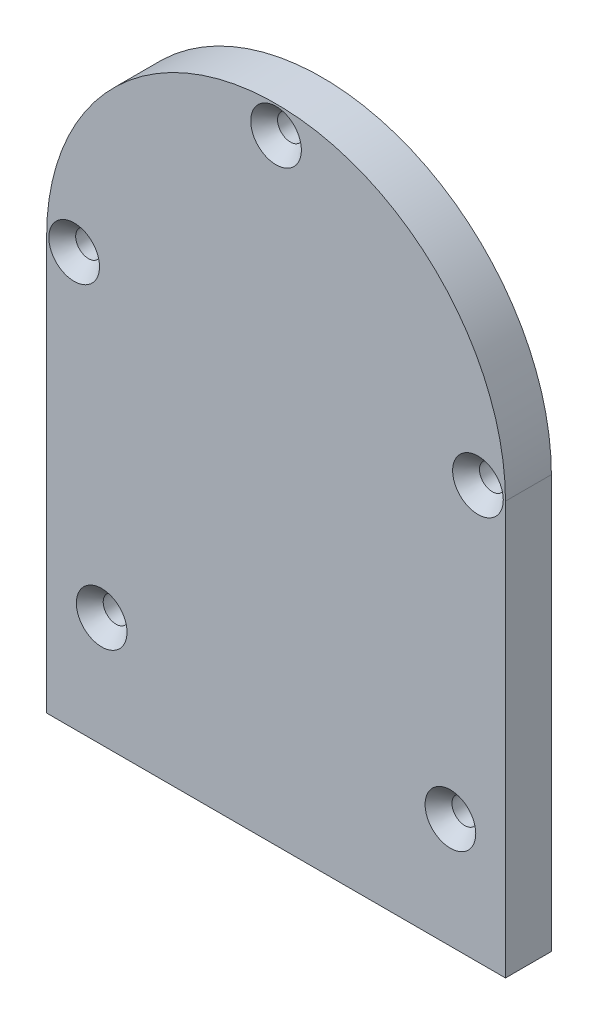
ISO-10303-21;
HEADER;
FILE_DESCRIPTION(('STEP AP214'),'2;1');
FILE_NAME('part.step','',(''),(''),'','','');
FILE_SCHEMA(('AUTOMOTIVE_DESIGN { 1 0 10303 214 1 1 1 1 }'));
ENDSEC;
DATA;
#1=APPLICATION_CONTEXT('core data for automotive mechanical design processes');
#2=APPLICATION_PROTOCOL_DEFINITION('international standard','automotive_design',2000,#1);
#3=PRODUCT_CONTEXT('',#1,'mechanical');
#4=PRODUCT('Part','Part','',(#3));
#5=PRODUCT_RELATED_PRODUCT_CATEGORY('part','',(#4));
#6=PRODUCT_DEFINITION_FORMATION('','',#4);
#7=PRODUCT_DEFINITION_CONTEXT('part definition',#1,'design');
#8=PRODUCT_DEFINITION('design','',#6,#7);
#9=PRODUCT_DEFINITION_SHAPE('','',#8);
#10=(LENGTH_UNIT() NAMED_UNIT(*) SI_UNIT(.MILLI.,.METRE.));
#11=(NAMED_UNIT(*) PLANE_ANGLE_UNIT() SI_UNIT($,.RADIAN.));
#12=(NAMED_UNIT(*) SI_UNIT($,.STERADIAN.) SOLID_ANGLE_UNIT());
#13=UNCERTAINTY_MEASURE_WITH_UNIT(LENGTH_MEASURE(1.E-05),#10,'distance_accuracy_value','');
#14=(GEOMETRIC_REPRESENTATION_CONTEXT(3) GLOBAL_UNCERTAINTY_ASSIGNED_CONTEXT((#13)) GLOBAL_UNIT_ASSIGNED_CONTEXT((#10,
#11,#12)) REPRESENTATION_CONTEXT('',''));
#15=CARTESIAN_POINT('',(0.,0.,0.));
#16=DIRECTION('',(0.,0.,1.));
#17=DIRECTION('',(1.,0.,0.));
#18=AXIS2_PLACEMENT_3D('',#15,#16,#17);
#19=CARTESIAN_POINT('',(0.,0.,3.175));
#20=DIRECTION('',(0.,0.,-1.));
#21=DIRECTION('',(-1.,0.,0.));
#22=AXIS2_PLACEMENT_3D('',#19,#20,#21);
#23=CYLINDRICAL_SURFACE('',#22,15.875);
#24=CARTESIAN_POINT('',(0.,0.,0.));
#25=DIRECTION('',(0.,0.,1.));
#26=DIRECTION('',(1.,0.,0.));
#27=AXIS2_PLACEMENT_3D('',#24,#25,#26);
#28=CIRCLE('',#27,15.875);
#29=CARTESIAN_POINT('',(15.875,0.,0.));
#30=VERTEX_POINT('',#29);
#31=CARTESIAN_POINT('',(-15.875,0.,0.));
#32=VERTEX_POINT('',#31);
#33=EDGE_CURVE('E95',#30,#32,#28,.T.);
#34=ORIENTED_EDGE('',*,*,#33,.T.);
#35=DIRECTION('',(0.,0.,-1.));
#36=VECTOR('',#35,1.);
#37=CARTESIAN_POINT('',(-15.875,0.,3.175));
#38=LINE('',#37,#36);
#39=CARTESIAN_POINT('',(-15.875,0.,3.175));
#40=VERTEX_POINT('',#39);
#41=EDGE_CURVE('E11',#40,#32,#38,.T.);
#42=ORIENTED_EDGE('',*,*,#41,.F.);
#43=CARTESIAN_POINT('',(0.,0.,3.175));
#44=DIRECTION('',(0.,0.,1.));
#45=DIRECTION('',(1.,0.,0.));
#46=AXIS2_PLACEMENT_3D('',#43,#44,#45);
#47=CIRCLE('',#46,15.875);
#48=CARTESIAN_POINT('',(15.875,0.,3.175));
#49=VERTEX_POINT('',#48);
#50=EDGE_CURVE('E83',#49,#40,#47,.T.);
#51=ORIENTED_EDGE('',*,*,#50,.F.);
#52=DIRECTION('',(0.,0.,-1.));
#53=VECTOR('',#52,1.);
#54=CARTESIAN_POINT('',(15.875,0.,3.175));
#55=LINE('',#54,#53);
#56=EDGE_CURVE('E91',#49,#30,#55,.T.);
#57=ORIENTED_EDGE('',*,*,#56,.T.);
#58=EDGE_LOOP('',(#34,#42,#51,#57));
#59=FACE_BOUND('',#58,.T.);
#60=ADVANCED_FACE('F32',(#59),#23,.T.);
#61=CARTESIAN_POINT('',(-15.875,0.,3.175));
#62=DIRECTION('',(1.,0.,0.));
#63=DIRECTION('',(0.,1.,0.));
#64=AXIS2_PLACEMENT_3D('',#61,#62,#63);
#65=PLANE('',#64);
#66=DIRECTION('',(0.,-1.,0.));
#67=VECTOR('',#66,1.);
#68=CARTESIAN_POINT('',(-15.875,0.,0.));
#69=LINE('',#68,#67);
#70=CARTESIAN_POINT('',(-15.875,-28.575,0.));
#71=VERTEX_POINT('',#70);
#72=EDGE_CURVE('E87',#32,#71,#69,.T.);
#73=ORIENTED_EDGE('',*,*,#72,.T.);
#74=DIRECTION('',(0.,0.,-1.));
#75=VECTOR('',#74,1.);
#76=CARTESIAN_POINT('',(-15.875,-28.575,3.175));
#77=LINE('',#76,#75);
#78=CARTESIAN_POINT('',(-15.875,-28.575,3.175));
#79=VERTEX_POINT('',#78);
#80=EDGE_CURVE('E40',#79,#71,#77,.T.);
#81=ORIENTED_EDGE('',*,*,#80,.F.);
#82=DIRECTION('',(0.,-1.,0.));
#83=VECTOR('',#82,1.);
#84=CARTESIAN_POINT('',(-15.875,0.,3.175));
#85=LINE('',#84,#83);
#86=EDGE_CURVE('E78',#40,#79,#85,.T.);
#87=ORIENTED_EDGE('',*,*,#86,.F.);
#88=ORIENTED_EDGE('',*,*,#41,.T.);
#89=EDGE_LOOP('',(#73,#81,#87,#88));
#90=FACE_BOUND('',#89,.T.);
#91=ADVANCED_FACE('F86',(#90),#65,.F.);
#92=CARTESIAN_POINT('',(-15.875,-28.575,3.175));
#93=DIRECTION('',(0.,1.,0.));
#94=DIRECTION('',(0.,0.,1.));
#95=AXIS2_PLACEMENT_3D('',#92,#93,#94);
#96=PLANE('',#95);
#97=DIRECTION('',(1.,0.,0.));
#98=VECTOR('',#97,1.);
#99=CARTESIAN_POINT('',(-15.875,-28.575,0.));
#100=LINE('',#99,#98);
#101=CARTESIAN_POINT('',(15.875,-28.575,0.));
#102=VERTEX_POINT('',#101);
#103=EDGE_CURVE('E65',#71,#102,#100,.T.);
#104=ORIENTED_EDGE('',*,*,#103,.T.);
#105=DIRECTION('',(0.,0.,-1.));
#106=VECTOR('',#105,1.);
#107=CARTESIAN_POINT('',(15.875,-28.575,3.175));
#108=LINE('',#107,#106);
#109=CARTESIAN_POINT('',(15.875,-28.575,3.175));
#110=VERTEX_POINT('',#109);
#111=EDGE_CURVE('E88',#110,#102,#108,.T.);
#112=ORIENTED_EDGE('',*,*,#111,.F.);
#113=DIRECTION('',(1.,0.,0.));
#114=VECTOR('',#113,1.);
#115=CARTESIAN_POINT('',(-15.875,-28.575,3.175));
#116=LINE('',#115,#114);
#117=EDGE_CURVE('E81',#79,#110,#116,.T.);
#118=ORIENTED_EDGE('',*,*,#117,.F.);
#119=ORIENTED_EDGE('',*,*,#80,.T.);
#120=EDGE_LOOP('',(#104,#112,#118,#119));
#121=FACE_BOUND('',#120,.T.);
#122=ADVANCED_FACE('F89',(#121),#96,.F.);
#123=CARTESIAN_POINT('',(15.875,-28.575,3.175));
#124=DIRECTION('',(-1.,0.,0.));
#125=DIRECTION('',(0.,-1.,0.));
#126=AXIS2_PLACEMENT_3D('',#123,#124,#125);
#127=PLANE('',#126);
#128=DIRECTION('',(0.,1.,0.));
#129=VECTOR('',#128,1.);
#130=CARTESIAN_POINT('',(15.875,-28.575,0.));
#131=LINE('',#130,#129);
#132=EDGE_CURVE('E71',#102,#30,#131,.T.);
#133=ORIENTED_EDGE('',*,*,#132,.T.);
#134=ORIENTED_EDGE('',*,*,#56,.F.);
#135=DIRECTION('',(0.,1.,0.));
#136=VECTOR('',#135,1.);
#137=CARTESIAN_POINT('',(15.875,-28.575,3.175));
#138=LINE('',#137,#136);
#139=EDGE_CURVE('E48',#110,#49,#138,.T.);
#140=ORIENTED_EDGE('',*,*,#139,.F.);
#141=ORIENTED_EDGE('',*,*,#111,.T.);
#142=EDGE_LOOP('',(#133,#134,#140,#141));
#143=FACE_BOUND('',#142,.T.);
#144=ADVANCED_FACE('F103',(#143),#127,.F.);
#145=CARTESIAN_POINT('',(0.,0.,3.175));
#146=DIRECTION('',(0.,0.,1.));
#147=DIRECTION('',(1.,0.,0.));
#148=AXIS2_PLACEMENT_3D('',#145,#146,#147);
#149=PLANE('',#148);
#150=CARTESIAN_POINT('',(0.,13.97,3.175));
#151=DIRECTION('',(0.,0.,1.));
#152=DIRECTION('',(1.,0.,0.));
#153=AXIS2_PLACEMENT_3D('',#150,#151,#152);
#154=CIRCLE('',#153,1.7526);
#155=CARTESIAN_POINT('',(1.7526,13.97,3.175));
#156=VERTEX_POINT('',#155);
#157=EDGE_CURVE('E150',#156,#156,#154,.T.);
#158=ORIENTED_EDGE('',*,*,#157,.F.);
#159=EDGE_LOOP('',(#158));
#160=FACE_BOUND('',#159,.T.);
#161=CARTESIAN_POINT('',(-13.97,0.,3.175));
#162=DIRECTION('',(0.,0.,1.));
#163=DIRECTION('',(1.,0.,0.));
#164=AXIS2_PLACEMENT_3D('',#161,#162,#163);
#165=CIRCLE('',#164,1.7526);
#166=CARTESIAN_POINT('',(-12.2174,0.,3.175));
#167=VERTEX_POINT('',#166);
#168=EDGE_CURVE('E141',#167,#167,#165,.T.);
#169=ORIENTED_EDGE('',*,*,#168,.F.);
#170=EDGE_LOOP('',(#169));
#171=FACE_BOUND('',#170,.T.);
#172=CARTESIAN_POINT('',(13.97,0.,3.175));
#173=DIRECTION('',(0.,0.,1.));
#174=DIRECTION('',(1.,0.,0.));
#175=AXIS2_PLACEMENT_3D('',#172,#173,#174);
#176=CIRCLE('',#175,1.7526);
#177=CARTESIAN_POINT('',(15.7226,0.,3.175));
#178=VERTEX_POINT('',#177);
#179=EDGE_CURVE('E132',#178,#178,#176,.T.);
#180=ORIENTED_EDGE('',*,*,#179,.F.);
#181=EDGE_LOOP('',(#180));
#182=FACE_BOUND('',#181,.T.);
#183=CARTESIAN_POINT('',(-12.065,-20.955,3.175));
#184=DIRECTION('',(0.,0.,1.));
#185=DIRECTION('',(1.,0.,0.));
#186=AXIS2_PLACEMENT_3D('',#183,#184,#185);
#187=CIRCLE('',#186,1.7526);
#188=CARTESIAN_POINT('',(-10.3124,-20.955,3.175));
#189=VERTEX_POINT('',#188);
#190=EDGE_CURVE('E123',#189,#189,#187,.T.);
#191=ORIENTED_EDGE('',*,*,#190,.F.);
#192=EDGE_LOOP('',(#191));
#193=FACE_BOUND('',#192,.T.);
#194=CARTESIAN_POINT('',(12.065,-20.955,3.175));
#195=DIRECTION('',(0.,0.,1.));
#196=DIRECTION('',(1.,0.,0.));
#197=AXIS2_PLACEMENT_3D('',#194,#195,#196);
#198=CIRCLE('',#197,1.7526);
#199=CARTESIAN_POINT('',(13.8176,-20.955,3.175));
#200=VERTEX_POINT('',#199);
#201=EDGE_CURVE('E114',#200,#200,#198,.T.);
#202=ORIENTED_EDGE('',*,*,#201,.F.);
#203=EDGE_LOOP('',(#202));
#204=FACE_BOUND('',#203,.T.);
#205=ORIENTED_EDGE('',*,*,#50,.T.);
#206=ORIENTED_EDGE('',*,*,#86,.T.);
#207=ORIENTED_EDGE('',*,*,#117,.T.);
#208=ORIENTED_EDGE('',*,*,#139,.T.);
#209=EDGE_LOOP('',(#205,#206,#207,#208));
#210=FACE_BOUND('',#209,.T.);
#211=ADVANCED_FACE('F79',(#160,#171,#182,#193,#204,#210),#149,.T.);
#212=CARTESIAN_POINT('',(0.,0.,0.));
#213=DIRECTION('',(0.,0.,1.));
#214=DIRECTION('',(1.,0.,0.));
#215=AXIS2_PLACEMENT_3D('',#212,#213,#214);
#216=PLANE('',#215);
#217=CARTESIAN_POINT('',(0.,13.97,0.));
#218=DIRECTION('',(0.,0.,1.));
#219=DIRECTION('',(1.,0.,0.));
#220=AXIS2_PLACEMENT_3D('',#217,#218,#219);
#221=CIRCLE('',#220,0.888999999999999);
#222=CARTESIAN_POINT('',(0.888999999999999,13.97,0.));
#223=VERTEX_POINT('',#222);
#224=EDGE_CURVE('E144',#223,#223,#221,.T.);
#225=ORIENTED_EDGE('',*,*,#224,.T.);
#226=EDGE_LOOP('',(#225));
#227=FACE_BOUND('',#226,.T.);
#228=CARTESIAN_POINT('',(-13.97,0.,0.));
#229=DIRECTION('',(0.,0.,1.));
#230=DIRECTION('',(1.,0.,0.));
#231=AXIS2_PLACEMENT_3D('',#228,#229,#230);
#232=CIRCLE('',#231,0.888999999999999);
#233=CARTESIAN_POINT('',(-13.081,0.,0.));
#234=VERTEX_POINT('',#233);
#235=EDGE_CURVE('E135',#234,#234,#232,.T.);
#236=ORIENTED_EDGE('',*,*,#235,.T.);
#237=EDGE_LOOP('',(#236));
#238=FACE_BOUND('',#237,.T.);
#239=CARTESIAN_POINT('',(13.97,0.,0.));
#240=DIRECTION('',(0.,0.,1.));
#241=DIRECTION('',(1.,0.,0.));
#242=AXIS2_PLACEMENT_3D('',#239,#240,#241);
#243=CIRCLE('',#242,0.888999999999999);
#244=CARTESIAN_POINT('',(14.859,0.,0.));
#245=VERTEX_POINT('',#244);
#246=EDGE_CURVE('E126',#245,#245,#243,.T.);
#247=ORIENTED_EDGE('',*,*,#246,.T.);
#248=EDGE_LOOP('',(#247));
#249=FACE_BOUND('',#248,.T.);
#250=CARTESIAN_POINT('',(-12.065,-20.955,0.));
#251=DIRECTION('',(0.,0.,1.));
#252=DIRECTION('',(1.,0.,0.));
#253=AXIS2_PLACEMENT_3D('',#250,#251,#252);
#254=CIRCLE('',#253,0.888999999999999);
#255=CARTESIAN_POINT('',(-11.176,-20.955,0.));
#256=VERTEX_POINT('',#255);
#257=EDGE_CURVE('E117',#256,#256,#254,.T.);
#258=ORIENTED_EDGE('',*,*,#257,.T.);
#259=EDGE_LOOP('',(#258));
#260=FACE_BOUND('',#259,.T.);
#261=CARTESIAN_POINT('',(12.065,-20.955,0.));
#262=DIRECTION('',(0.,0.,1.));
#263=DIRECTION('',(1.,0.,0.));
#264=AXIS2_PLACEMENT_3D('',#261,#262,#263);
#265=CIRCLE('',#264,0.888999999999999);
#266=CARTESIAN_POINT('',(12.954,-20.955,0.));
#267=VERTEX_POINT('',#266);
#268=EDGE_CURVE('E98',#267,#267,#265,.T.);
#269=ORIENTED_EDGE('',*,*,#268,.T.);
#270=EDGE_LOOP('',(#269));
#271=FACE_BOUND('',#270,.T.);
#272=ORIENTED_EDGE('',*,*,#33,.F.);
#273=ORIENTED_EDGE('',*,*,#132,.F.);
#274=ORIENTED_EDGE('',*,*,#103,.F.);
#275=ORIENTED_EDGE('',*,*,#72,.F.);
#276=EDGE_LOOP('',(#272,#273,#274,#275));
#277=FACE_BOUND('',#276,.T.);
#278=ADVANCED_FACE('F106',(#227,#238,#249,#260,#271,#277),#216,.F.);
#279=CARTESIAN_POINT('',(12.065,-20.955,3.175));
#280=DIRECTION('',(0.,0.,1.));
#281=DIRECTION('',(1.,0.,0.));
#282=AXIS2_PLACEMENT_3D('',#279,#280,#281);
#283=CYLINDRICAL_SURFACE('',#282,0.888999999999999);
#284=ORIENTED_EDGE('',*,*,#268,.F.);
#285=EDGE_LOOP('',(#284));
#286=FACE_BOUND('',#285,.T.);
#287=CARTESIAN_POINT('',(12.065,-20.955,2.18154184352394));
#288=DIRECTION('',(0.,0.,1.));
#289=DIRECTION('',(1.,0.,0.));
#290=AXIS2_PLACEMENT_3D('',#287,#288,#289);
#291=CIRCLE('',#290,0.888999999999999);
#292=CARTESIAN_POINT('',(12.954,-20.955,2.18154184352394));
#293=VERTEX_POINT('',#292);
#294=EDGE_CURVE('E111',#293,#293,#291,.T.);
#295=ORIENTED_EDGE('',*,*,#294,.T.);
#296=EDGE_LOOP('',(#295));
#297=FACE_BOUND('',#296,.T.);
#298=ADVANCED_FACE('F170',(#286,#297),#283,.F.);
#299=CARTESIAN_POINT('',(12.065,-20.955,3.175));
#300=DIRECTION('',(0.,0.,1.));
#301=DIRECTION('',(1.,0.,0.));
#302=AXIS2_PLACEMENT_3D('',#299,#300,#301);
#303=CONICAL_SURFACE('',#302,1.7526,0.715584993317675);
#304=ORIENTED_EDGE('',*,*,#294,.F.);
#305=EDGE_LOOP('',(#304));
#306=FACE_BOUND('',#305,.T.);
#307=ORIENTED_EDGE('',*,*,#201,.T.);
#308=EDGE_LOOP('',(#307));
#309=FACE_BOUND('',#308,.T.);
#310=ADVANCED_FACE('F167',(#306,#309),#303,.F.);
#311=CARTESIAN_POINT('',(-12.065,-20.955,3.175));
#312=DIRECTION('',(0.,0.,1.));
#313=DIRECTION('',(1.,0.,0.));
#314=AXIS2_PLACEMENT_3D('',#311,#312,#313);
#315=CYLINDRICAL_SURFACE('',#314,0.888999999999999);
#316=ORIENTED_EDGE('',*,*,#257,.F.);
#317=EDGE_LOOP('',(#316));
#318=FACE_BOUND('',#317,.T.);
#319=CARTESIAN_POINT('',(-12.065,-20.955,2.18154184352394));
#320=DIRECTION('',(0.,0.,1.));
#321=DIRECTION('',(1.,0.,0.));
#322=AXIS2_PLACEMENT_3D('',#319,#320,#321);
#323=CIRCLE('',#322,0.888999999999999);
#324=CARTESIAN_POINT('',(-11.176,-20.955,2.18154184352394));
#325=VERTEX_POINT('',#324);
#326=EDGE_CURVE('E120',#325,#325,#323,.T.);
#327=ORIENTED_EDGE('',*,*,#326,.T.);
#328=EDGE_LOOP('',(#327));
#329=FACE_BOUND('',#328,.T.);
#330=ADVANCED_FACE('F169',(#318,#329),#315,.F.);
#331=CARTESIAN_POINT('',(-12.065,-20.955,3.175));
#332=DIRECTION('',(0.,0.,1.));
#333=DIRECTION('',(1.,0.,0.));
#334=AXIS2_PLACEMENT_3D('',#331,#332,#333);
#335=CONICAL_SURFACE('',#334,1.7526,0.715584993317675);
#336=ORIENTED_EDGE('',*,*,#326,.F.);
#337=EDGE_LOOP('',(#336));
#338=FACE_BOUND('',#337,.T.);
#339=ORIENTED_EDGE('',*,*,#190,.T.);
#340=EDGE_LOOP('',(#339));
#341=FACE_BOUND('',#340,.T.);
#342=ADVANCED_FACE('F177',(#338,#341),#335,.F.);
#343=CARTESIAN_POINT('',(13.97,0.,3.175));
#344=DIRECTION('',(0.,0.,1.));
#345=DIRECTION('',(1.,0.,0.));
#346=AXIS2_PLACEMENT_3D('',#343,#344,#345);
#347=CYLINDRICAL_SURFACE('',#346,0.888999999999999);
#348=ORIENTED_EDGE('',*,*,#246,.F.);
#349=EDGE_LOOP('',(#348));
#350=FACE_BOUND('',#349,.T.);
#351=CARTESIAN_POINT('',(13.97,0.,2.18154184352394));
#352=DIRECTION('',(0.,0.,1.));
#353=DIRECTION('',(1.,0.,0.));
#354=AXIS2_PLACEMENT_3D('',#351,#352,#353);
#355=CIRCLE('',#354,0.888999999999999);
#356=CARTESIAN_POINT('',(14.859,0.,2.18154184352394));
#357=VERTEX_POINT('',#356);
#358=EDGE_CURVE('E129',#357,#357,#355,.T.);
#359=ORIENTED_EDGE('',*,*,#358,.T.);
#360=EDGE_LOOP('',(#359));
#361=FACE_BOUND('',#360,.T.);
#362=ADVANCED_FACE('F213',(#350,#361),#347,.F.);
#363=CARTESIAN_POINT('',(13.97,0.,3.175));
#364=DIRECTION('',(0.,0.,1.));
#365=DIRECTION('',(1.,0.,0.));
#366=AXIS2_PLACEMENT_3D('',#363,#364,#365);
#367=CONICAL_SURFACE('',#366,1.7526,0.715584993317676);
#368=ORIENTED_EDGE('',*,*,#358,.F.);
#369=EDGE_LOOP('',(#368));
#370=FACE_BOUND('',#369,.T.);
#371=ORIENTED_EDGE('',*,*,#179,.T.);
#372=EDGE_LOOP('',(#371));
#373=FACE_BOUND('',#372,.T.);
#374=ADVANCED_FACE('F218',(#370,#373),#367,.F.);
#375=CARTESIAN_POINT('',(-13.97,0.,3.175));
#376=DIRECTION('',(0.,0.,1.));
#377=DIRECTION('',(1.,0.,0.));
#378=AXIS2_PLACEMENT_3D('',#375,#376,#377);
#379=CYLINDRICAL_SURFACE('',#378,0.888999999999999);
#380=ORIENTED_EDGE('',*,*,#235,.F.);
#381=EDGE_LOOP('',(#380));
#382=FACE_BOUND('',#381,.T.);
#383=CARTESIAN_POINT('',(-13.97,0.,2.18154184352394));
#384=DIRECTION('',(0.,0.,1.));
#385=DIRECTION('',(1.,0.,0.));
#386=AXIS2_PLACEMENT_3D('',#383,#384,#385);
#387=CIRCLE('',#386,0.888999999999999);
#388=CARTESIAN_POINT('',(-13.081,0.,2.18154184352394));
#389=VERTEX_POINT('',#388);
#390=EDGE_CURVE('E138',#389,#389,#387,.T.);
#391=ORIENTED_EDGE('',*,*,#390,.T.);
#392=EDGE_LOOP('',(#391));
#393=FACE_BOUND('',#392,.T.);
#394=ADVANCED_FACE('F224',(#382,#393),#379,.F.);
#395=CARTESIAN_POINT('',(-13.97,0.,3.175));
#396=DIRECTION('',(0.,0.,1.));
#397=DIRECTION('',(1.,0.,0.));
#398=AXIS2_PLACEMENT_3D('',#395,#396,#397);
#399=CONICAL_SURFACE('',#398,1.7526,0.715584993317675);
#400=ORIENTED_EDGE('',*,*,#390,.F.);
#401=EDGE_LOOP('',(#400));
#402=FACE_BOUND('',#401,.T.);
#403=ORIENTED_EDGE('',*,*,#168,.T.);
#404=EDGE_LOOP('',(#403));
#405=FACE_BOUND('',#404,.T.);
#406=ADVANCED_FACE('F228',(#402,#405),#399,.F.);
#407=CARTESIAN_POINT('',(0.,13.97,3.175));
#408=DIRECTION('',(0.,0.,1.));
#409=DIRECTION('',(1.,0.,0.));
#410=AXIS2_PLACEMENT_3D('',#407,#408,#409);
#411=CYLINDRICAL_SURFACE('',#410,0.889);
#412=ORIENTED_EDGE('',*,*,#224,.F.);
#413=EDGE_LOOP('',(#412));
#414=FACE_BOUND('',#413,.T.);
#415=CARTESIAN_POINT('',(0.,13.97,2.18154184352394));
#416=DIRECTION('',(0.,0.,1.));
#417=DIRECTION('',(1.,0.,0.));
#418=AXIS2_PLACEMENT_3D('',#415,#416,#417);
#419=CIRCLE('',#418,0.889);
#420=CARTESIAN_POINT('',(0.889,13.97,2.18154184352394));
#421=VERTEX_POINT('',#420);
#422=EDGE_CURVE('E147',#421,#421,#419,.T.);
#423=ORIENTED_EDGE('',*,*,#422,.T.);
#424=EDGE_LOOP('',(#423));
#425=FACE_BOUND('',#424,.T.);
#426=ADVANCED_FACE('F232',(#414,#425),#411,.F.);
#427=CARTESIAN_POINT('',(0.,13.97,3.175));
#428=DIRECTION('',(0.,0.,1.));
#429=DIRECTION('',(1.,0.,0.));
#430=AXIS2_PLACEMENT_3D('',#427,#428,#429);
#431=CONICAL_SURFACE('',#430,1.7526,0.715584993317675);
#432=ORIENTED_EDGE('',*,*,#422,.F.);
#433=EDGE_LOOP('',(#432));
#434=FACE_BOUND('',#433,.T.);
#435=ORIENTED_EDGE('',*,*,#157,.T.);
#436=EDGE_LOOP('',(#435));
#437=FACE_BOUND('',#436,.T.);
#438=ADVANCED_FACE('F154',(#434,#437),#431,.F.);
#439=CLOSED_SHELL('',(#60,#91,#122,#144,#211,#278,#298,#310,#330,#342,#362,#374,#394,#406,#426,#438));
#440=MANIFOLD_SOLID_BREP('B2',#439);
#441=ADVANCED_BREP_SHAPE_REPRESENTATION('',(#18,#440),#14);
#442=SHAPE_DEFINITION_REPRESENTATION(#9,#441);
ENDSEC;
END-ISO-10303-21;
